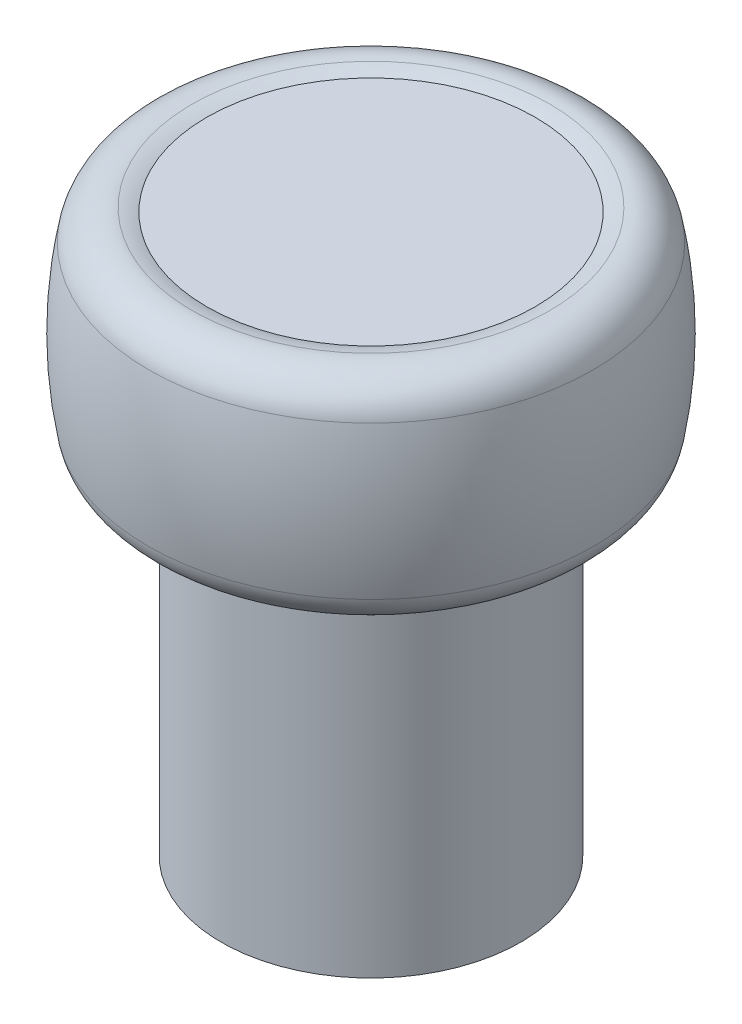
ISO-10303-21;
HEADER;
FILE_DESCRIPTION(('STEP AP214'),'2;1');
FILE_NAME('part.step','',(''),(''),'','','');
FILE_SCHEMA(('AUTOMOTIVE_DESIGN { 1 0 10303 214 1 1 1 1 }'));
ENDSEC;
DATA;
#1=APPLICATION_CONTEXT('core data for automotive mechanical design processes');
#2=APPLICATION_PROTOCOL_DEFINITION('international standard','automotive_design',2000,#1);
#3=PRODUCT_CONTEXT('',#1,'mechanical');
#4=PRODUCT('Part','Part','',(#3));
#5=PRODUCT_RELATED_PRODUCT_CATEGORY('part','',(#4));
#6=PRODUCT_DEFINITION_FORMATION('','',#4);
#7=PRODUCT_DEFINITION_CONTEXT('part definition',#1,'design');
#8=PRODUCT_DEFINITION('design','',#6,#7);
#9=PRODUCT_DEFINITION_SHAPE('','',#8);
#10=(LENGTH_UNIT() NAMED_UNIT(*) SI_UNIT(.MILLI.,.METRE.));
#11=(NAMED_UNIT(*) PLANE_ANGLE_UNIT() SI_UNIT($,.RADIAN.));
#12=(NAMED_UNIT(*) SI_UNIT($,.STERADIAN.) SOLID_ANGLE_UNIT());
#13=UNCERTAINTY_MEASURE_WITH_UNIT(LENGTH_MEASURE(1.E-05),#10,'distance_accuracy_value','');
#14=(GEOMETRIC_REPRESENTATION_CONTEXT(3) GLOBAL_UNCERTAINTY_ASSIGNED_CONTEXT((#13)) GLOBAL_UNIT_ASSIGNED_CONTEXT((#10,
#11,#12)) REPRESENTATION_CONTEXT('',''));
#15=CARTESIAN_POINT('',(0.,0.,0.));
#16=DIRECTION('',(0.,0.,1.));
#17=DIRECTION('',(1.,0.,0.));
#18=AXIS2_PLACEMENT_3D('',#15,#16,#17);
#19=CARTESIAN_POINT('',(-10.75,0.,0.));
#20=DIRECTION('',(0.,1.,0.));
#21=DIRECTION('',(0.,0.,1.));
#22=AXIS2_PLACEMENT_3D('',#19,#20,#21);
#23=PLANE('',#22);
#24=CARTESIAN_POINT('',(0.,0.,0.));
#25=DIRECTION('',(0.,-1.,0.));
#26=DIRECTION('',(0.,0.,-1.));
#27=AXIS2_PLACEMENT_3D('',#24,#25,#26);
#28=CIRCLE('',#27,10.75);
#29=CARTESIAN_POINT('',(0.,0.,-10.75));
#30=VERTEX_POINT('',#29);
#31=EDGE_CURVE('E52',#30,#30,#28,.T.);
#32=ORIENTED_EDGE('',*,*,#31,.T.);
#33=EDGE_LOOP('',(#32));
#34=FACE_BOUND('',#33,.T.);
#35=ADVANCED_FACE('F32',(#34),#23,.F.);
#36=CARTESIAN_POINT('',(0.,0.,0.));
#37=DIRECTION('',(0.,-1.,0.));
#38=DIRECTION('',(0.,0.,-1.));
#39=AXIS2_PLACEMENT_3D('',#36,#37,#38);
#40=CYLINDRICAL_SURFACE('',#39,10.75);
#41=ORIENTED_EDGE('',*,*,#31,.F.);
#42=EDGE_LOOP('',(#41));
#43=FACE_BOUND('',#42,.T.);
#44=CARTESIAN_POINT('',(0.,24.9970225641964,0.));
#45=DIRECTION('',(0.,-1.,0.));
#46=DIRECTION('',(0.,0.,-1.));
#47=AXIS2_PLACEMENT_3D('',#44,#45,#46);
#48=CIRCLE('',#47,10.75);
#49=CARTESIAN_POINT('',(0.,24.9970225641964,-10.75));
#50=VERTEX_POINT('',#49);
#51=EDGE_CURVE('E55',#50,#50,#48,.T.);
#52=ORIENTED_EDGE('',*,*,#51,.T.);
#53=EDGE_LOOP('',(#52));
#54=FACE_BOUND('',#53,.T.);
#55=ADVANCED_FACE('F76',(#43,#54),#40,.T.);
#56=CARTESIAN_POINT('',(-15.5,24.9970225641964,0.));
#57=DIRECTION('',(0.,1.,0.));
#58=DIRECTION('',(0.,0.,1.));
#59=AXIS2_PLACEMENT_3D('',#56,#57,#58);
#60=PLANE('',#59);
#61=CARTESIAN_POINT('',(0.,24.9970225641964,0.));
#62=DIRECTION('',(0.,1.,0.));
#63=DIRECTION('',(0.,0.,1.));
#64=AXIS2_PLACEMENT_3D('',#61,#62,#63);
#65=CIRCLE('',#64,13.3273342041977);
#66=CARTESIAN_POINT('',(0.,24.9970225641964,13.3273342041977));
#67=VERTEX_POINT('',#66);
#68=EDGE_CURVE('E10',#67,#67,#65,.F.);
#69=ORIENTED_EDGE('',*,*,#68,.T.);
#70=EDGE_LOOP('',(#69));
#71=FACE_BOUND('',#70,.T.);
#72=ORIENTED_EDGE('',*,*,#51,.F.);
#73=EDGE_LOOP('',(#72));
#74=FACE_BOUND('',#73,.T.);
#75=ADVANCED_FACE('F82',(#71,#74),#60,.F.);
#76=CARTESIAN_POINT('',(0.,32.4970225641964,0.));
#77=DIRECTION('',(0.,-1.,0.));
#78=DIRECTION('',(0.,0.,-1.));
#79=AXIS2_PLACEMENT_3D('',#76,#77,#78);
#80=DEGENERATE_TOROIDAL_SURFACE('',#79,13.5473750965556,30.,.F.);
#81=CARTESIAN_POINT('',(0.,38.1347827254873,0.));
#82=DIRECTION('',(0.,-1.,0.));
#83=DIRECTION('',(0.,0.,-1.));
#84=AXIS2_PLACEMENT_3D('',#81,#82,#83);
#85=CIRCLE('',#84,15.9181243963049);
#86=CARTESIAN_POINT('',(0.,38.1347827254873,-15.9181243963049));
#87=VERTEX_POINT('',#86);
#88=EDGE_CURVE('E43',#87,#87,#85,.T.);
#89=ORIENTED_EDGE('',*,*,#88,.T.);
#90=EDGE_LOOP('',(#89));
#91=FACE_BOUND('',#90,.T.);
#92=CARTESIAN_POINT('',(0.,27.2222972894711,0.));
#93=DIRECTION('',(0.,1.,0.));
#94=DIRECTION('',(0.,0.,1.));
#95=AXIS2_PLACEMENT_3D('',#92,#93,#94);
#96=CIRCLE('',#95,15.9852724866898);
#97=CARTESIAN_POINT('',(0.,27.2222972894711,15.9852724866898));
#98=VERTEX_POINT('',#97);
#99=EDGE_CURVE('E47',#98,#98,#96,.T.);
#100=ORIENTED_EDGE('',*,*,#99,.T.);
#101=EDGE_LOOP('',(#100));
#102=FACE_BOUND('',#101,.T.);
#103=ADVANCED_FACE('F73',(#91,#102),#80,.F.);
#104=CARTESIAN_POINT('',(0.,35.3573493602765,0.));
#105=DIRECTION('',(0.,-1.,0.));
#106=DIRECTION('',(0.,0.,-1.));
#107=AXIS2_PLACEMENT_3D('',#104,#105,#106);
#108=TOROIDAL_SURFACE('',#107,13.6362852791193,5.);
#109=CARTESIAN_POINT('',(0.,40.2922079487431,0.));
#110=DIRECTION('',(0.,-1.,0.));
#111=DIRECTION('',(0.,0.,-1.));
#112=AXIS2_PLACEMENT_3D('',#109,#110,#111);
#113=CIRCLE('',#112,12.8318160678761);
#114=CARTESIAN_POINT('',(0.,40.2922079487431,-12.8318160678761));
#115=VERTEX_POINT('',#114);
#116=EDGE_CURVE('E39',#115,#115,#113,.F.);
#117=ORIENTED_EDGE('',*,*,#116,.T.);
#118=EDGE_LOOP('',(#117));
#119=FACE_BOUND('',#118,.T.);
#120=CARTESIAN_POINT('',(0.,40.,0.));
#121=DIRECTION('',(0.,-1.,0.));
#122=DIRECTION('',(0.,0.,-1.));
#123=AXIS2_PLACEMENT_3D('',#120,#121,#122);
#124=CIRCLE('',#123,11.78);
#125=CARTESIAN_POINT('',(0.,40.,-11.78));
#126=VERTEX_POINT('',#125);
#127=EDGE_CURVE('E58',#126,#126,#124,.T.);
#128=ORIENTED_EDGE('',*,*,#127,.T.);
#129=EDGE_LOOP('',(#128));
#130=FACE_BOUND('',#129,.T.);
#131=ADVANCED_FACE('F62',(#119,#130),#108,.T.);
#132=CARTESIAN_POINT('',(0.,40.,0.));
#133=DIRECTION('',(0.,-1.,0.));
#134=DIRECTION('',(0.,0.,-1.));
#135=AXIS2_PLACEMENT_3D('',#132,#133,#134);
#136=PLANE('',#135);
#137=ORIENTED_EDGE('',*,*,#127,.F.);
#138=EDGE_LOOP('',(#137));
#139=FACE_BOUND('',#138,.T.);
#140=ADVANCED_FACE('F64',(#139),#136,.F.);
#141=CARTESIAN_POINT('',(0.,37.6273843109711,0.));
#142=DIRECTION('',(0.,1.,0.));
#143=DIRECTION('',(0.,0.,1.));
#144=AXIS2_PLACEMENT_3D('',#141,#142,#143);
#145=TOROIDAL_SURFACE('',#144,13.2662294419474,2.7);
#146=ORIENTED_EDGE('',*,*,#116,.F.);
#147=EDGE_LOOP('',(#146));
#148=FACE_BOUND('',#147,.T.);
#149=ORIENTED_EDGE('',*,*,#88,.F.);
#150=EDGE_LOOP('',(#149));
#151=FACE_BOUND('',#150,.T.);
#152=ADVANCED_FACE('F66',(#148,#151),#145,.T.);
#153=CARTESIAN_POINT('',(0.,27.6970225641964,0.));
#154=DIRECTION('',(0.,1.,0.));
#155=DIRECTION('',(0.,0.,1.));
#156=AXIS2_PLACEMENT_3D('',#153,#154,#155);
#157=TOROIDAL_SURFACE('',#156,13.3273342041977,2.7);
#158=ORIENTED_EDGE('',*,*,#99,.F.);
#159=EDGE_LOOP('',(#158));
#160=FACE_BOUND('',#159,.T.);
#161=ORIENTED_EDGE('',*,*,#68,.F.);
#162=EDGE_LOOP('',(#161));
#163=FACE_BOUND('',#162,.T.);
#164=ADVANCED_FACE('F34',(#160,#163),#157,.T.);
#165=CLOSED_SHELL('',(#35,#55,#75,#103,#131,#140,#152,#164));
#166=MANIFOLD_SOLID_BREP('B2',#165);
#167=ADVANCED_BREP_SHAPE_REPRESENTATION('',(#18,#166),#14);
#168=SHAPE_DEFINITION_REPRESENTATION(#9,#167);
ENDSEC;
END-ISO-10303-21;
